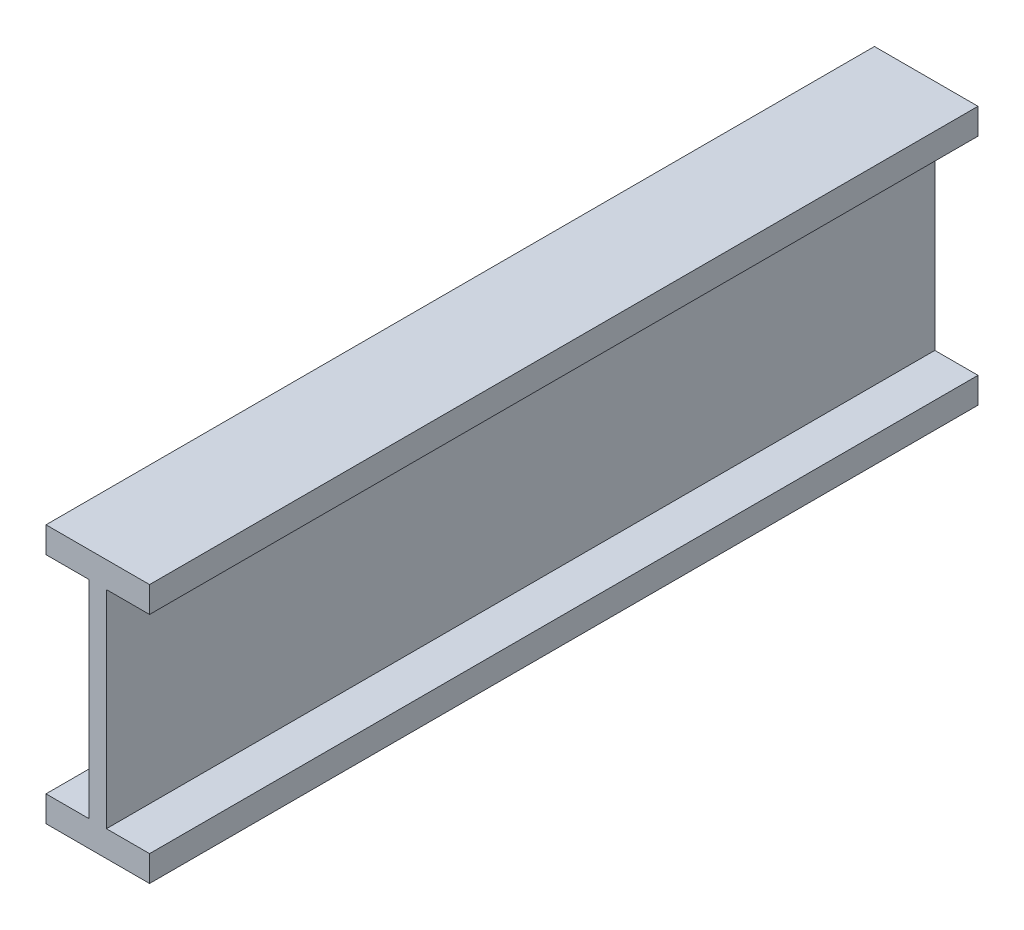
ISO-10303-21;
HEADER;
FILE_DESCRIPTION(('STEP AP214'),'2;1');
FILE_NAME('part.step','',(''),(''),'','','');
FILE_SCHEMA(('AUTOMOTIVE_DESIGN { 1 0 10303 214 1 1 1 1 }'));
ENDSEC;
DATA;
#1=APPLICATION_CONTEXT('core data for automotive mechanical design processes');
#2=APPLICATION_PROTOCOL_DEFINITION('international standard','automotive_design',2000,#1);
#3=PRODUCT_CONTEXT('',#1,'mechanical');
#4=PRODUCT('Part','Part','',(#3));
#5=PRODUCT_RELATED_PRODUCT_CATEGORY('part','',(#4));
#6=PRODUCT_DEFINITION_FORMATION('','',#4);
#7=PRODUCT_DEFINITION_CONTEXT('part definition',#1,'design');
#8=PRODUCT_DEFINITION('design','',#6,#7);
#9=PRODUCT_DEFINITION_SHAPE('','',#8);
#10=(LENGTH_UNIT() NAMED_UNIT(*) SI_UNIT(.MILLI.,.METRE.));
#11=(NAMED_UNIT(*) PLANE_ANGLE_UNIT() SI_UNIT($,.RADIAN.));
#12=(NAMED_UNIT(*) SI_UNIT($,.STERADIAN.) SOLID_ANGLE_UNIT());
#13=UNCERTAINTY_MEASURE_WITH_UNIT(LENGTH_MEASURE(1.E-05),#10,'distance_accuracy_value','');
#14=(GEOMETRIC_REPRESENTATION_CONTEXT(3) GLOBAL_UNCERTAINTY_ASSIGNED_CONTEXT((#13)) GLOBAL_UNIT_ASSIGNED_CONTEXT((#10,
#11,#12)) REPRESENTATION_CONTEXT('',''));
#15=CARTESIAN_POINT('',(0.,0.,0.));
#16=DIRECTION('',(0.,0.,1.));
#17=DIRECTION('',(1.,0.,0.));
#18=AXIS2_PLACEMENT_3D('',#15,#16,#17);
#19=CARTESIAN_POINT('',(76.2000000000001,0.,1219.2));
#20=DIRECTION('',(1.,0.,0.));
#21=DIRECTION('',(0.,1.,0.));
#22=AXIS2_PLACEMENT_3D('',#19,#20,#21);
#23=PLANE('',#22);
#24=DIRECTION('',(0.,-1.,0.));
#25=VECTOR('',#24,1.);
#26=CARTESIAN_POINT('',(76.2000000000001,0.,0.));
#27=LINE('',#26,#25);
#28=CARTESIAN_POINT('',(76.2,190.5,0.));
#29=VERTEX_POINT('',#28);
#30=CARTESIAN_POINT('',(76.2,152.4,0.));
#31=VERTEX_POINT('',#30);
#32=EDGE_CURVE('E196',#29,#31,#27,.T.);
#33=ORIENTED_EDGE('',*,*,#32,.F.);
#34=DIRECTION('',(0.,0.,-1.));
#35=VECTOR('',#34,1.);
#36=CARTESIAN_POINT('',(76.2,190.5,1219.2));
#37=LINE('',#36,#35);
#38=CARTESIAN_POINT('',(76.2,190.5,1219.2));
#39=VERTEX_POINT('',#38);
#40=EDGE_CURVE('E11',#39,#29,#37,.T.);
#41=ORIENTED_EDGE('',*,*,#40,.F.);
#42=DIRECTION('',(0.,-1.,0.));
#43=VECTOR('',#42,1.);
#44=CARTESIAN_POINT('',(76.2000000000001,0.,1219.2));
#45=LINE('',#44,#43);
#46=CARTESIAN_POINT('',(76.2,152.4,1219.2));
#47=VERTEX_POINT('',#46);
#48=EDGE_CURVE('E172',#39,#47,#45,.T.);
#49=ORIENTED_EDGE('',*,*,#48,.T.);
#50=DIRECTION('',(0.,0.,-1.));
#51=VECTOR('',#50,1.);
#52=CARTESIAN_POINT('',(76.2,152.4,1219.2));
#53=LINE('',#52,#51);
#54=EDGE_CURVE('E100',#47,#31,#53,.T.);
#55=ORIENTED_EDGE('',*,*,#54,.T.);
#56=EDGE_LOOP('',(#33,#41,#49,#55));
#57=FACE_BOUND('',#56,.T.);
#58=ADVANCED_FACE('F38',(#57),#23,.T.);
#59=CARTESIAN_POINT('',(0.,190.5,1219.2));
#60=DIRECTION('',(0.,1.,0.));
#61=DIRECTION('',(0.,0.,1.));
#62=AXIS2_PLACEMENT_3D('',#59,#60,#61);
#63=PLANE('',#62);
#64=DIRECTION('',(1.,0.,0.));
#65=VECTOR('',#64,1.);
#66=CARTESIAN_POINT('',(0.,190.5,0.));
#67=LINE('',#66,#65);
#68=CARTESIAN_POINT('',(-76.2,190.5,0.));
#69=VERTEX_POINT('',#68);
#70=EDGE_CURVE('E191',#69,#29,#67,.T.);
#71=ORIENTED_EDGE('',*,*,#70,.F.);
#72=DIRECTION('',(0.,0.,-1.));
#73=VECTOR('',#72,1.);
#74=CARTESIAN_POINT('',(-76.2,190.5,1219.2));
#75=LINE('',#74,#73);
#76=CARTESIAN_POINT('',(-76.2,190.5,1219.2));
#77=VERTEX_POINT('',#76);
#78=EDGE_CURVE('E46',#77,#69,#75,.T.);
#79=ORIENTED_EDGE('',*,*,#78,.F.);
#80=DIRECTION('',(1.,0.,0.));
#81=VECTOR('',#80,1.);
#82=CARTESIAN_POINT('',(0.,190.5,1219.2));
#83=LINE('',#82,#81);
#84=EDGE_CURVE('E169',#77,#39,#83,.T.);
#85=ORIENTED_EDGE('',*,*,#84,.T.);
#86=ORIENTED_EDGE('',*,*,#40,.T.);
#87=EDGE_LOOP('',(#71,#79,#85,#86));
#88=FACE_BOUND('',#87,.T.);
#89=ADVANCED_FACE('F234',(#88),#63,.T.);
#90=CARTESIAN_POINT('',(-76.2000000000001,0.,1219.2));
#91=DIRECTION('',(1.,0.,0.));
#92=DIRECTION('',(0.,1.,0.));
#93=AXIS2_PLACEMENT_3D('',#90,#91,#92);
#94=PLANE('',#93);
#95=DIRECTION('',(0.,-1.,0.));
#96=VECTOR('',#95,1.);
#97=CARTESIAN_POINT('',(-76.2000000000001,0.,0.));
#98=LINE('',#97,#96);
#99=CARTESIAN_POINT('',(-76.2,152.4,0.));
#100=VERTEX_POINT('',#99);
#101=EDGE_CURVE('E184',#69,#100,#98,.T.);
#102=ORIENTED_EDGE('',*,*,#101,.T.);
#103=DIRECTION('',(0.,0.,-1.));
#104=VECTOR('',#103,1.);
#105=CARTESIAN_POINT('',(-76.2,152.4,1219.2));
#106=LINE('',#105,#104);
#107=CARTESIAN_POINT('',(-76.2,152.4,1219.2));
#108=VERTEX_POINT('',#107);
#109=EDGE_CURVE('E226',#108,#100,#106,.T.);
#110=ORIENTED_EDGE('',*,*,#109,.F.);
#111=DIRECTION('',(0.,-1.,0.));
#112=VECTOR('',#111,1.);
#113=CARTESIAN_POINT('',(-76.2000000000001,0.,1219.2));
#114=LINE('',#113,#112);
#115=EDGE_CURVE('E165',#77,#108,#114,.T.);
#116=ORIENTED_EDGE('',*,*,#115,.F.);
#117=ORIENTED_EDGE('',*,*,#78,.T.);
#118=EDGE_LOOP('',(#102,#110,#116,#117));
#119=FACE_BOUND('',#118,.T.);
#120=ADVANCED_FACE('F228',(#119),#94,.F.);
#121=CARTESIAN_POINT('',(0.,152.4,1219.2));
#122=DIRECTION('',(0.,1.,0.));
#123=DIRECTION('',(0.,0.,1.));
#124=AXIS2_PLACEMENT_3D('',#121,#122,#123);
#125=PLANE('',#124);
#126=DIRECTION('',(1.,0.,0.));
#127=VECTOR('',#126,1.);
#128=CARTESIAN_POINT('',(0.,152.4,0.));
#129=LINE('',#128,#127);
#130=CARTESIAN_POINT('',(-12.7,152.4,0.));
#131=VERTEX_POINT('',#130);
#132=EDGE_CURVE('E175',#100,#131,#129,.T.);
#133=ORIENTED_EDGE('',*,*,#132,.T.);
#134=DIRECTION('',(0.,0.,-1.));
#135=VECTOR('',#134,1.);
#136=CARTESIAN_POINT('',(-12.7,152.4,1219.2));
#137=LINE('',#136,#135);
#138=CARTESIAN_POINT('',(-12.7,152.4,1219.2));
#139=VERTEX_POINT('',#138);
#140=EDGE_CURVE('E224',#139,#131,#137,.T.);
#141=ORIENTED_EDGE('',*,*,#140,.F.);
#142=DIRECTION('',(1.,0.,0.));
#143=VECTOR('',#142,1.);
#144=CARTESIAN_POINT('',(0.,152.4,1219.2));
#145=LINE('',#144,#143);
#146=EDGE_CURVE('E162',#108,#139,#145,.T.);
#147=ORIENTED_EDGE('',*,*,#146,.F.);
#148=ORIENTED_EDGE('',*,*,#109,.T.);
#149=EDGE_LOOP('',(#133,#141,#147,#148));
#150=FACE_BOUND('',#149,.T.);
#151=ADVANCED_FACE('F248',(#150),#125,.F.);
#152=CARTESIAN_POINT('',(-12.7,0.,1219.2));
#153=DIRECTION('',(-1.,0.,0.));
#154=DIRECTION('',(0.,0.,1.));
#155=AXIS2_PLACEMENT_3D('',#152,#153,#154);
#156=PLANE('',#155);
#157=DIRECTION('',(0.,1.,0.));
#158=VECTOR('',#157,1.);
#159=CARTESIAN_POINT('',(-12.7,0.,0.));
#160=LINE('',#159,#158);
#161=CARTESIAN_POINT('',(-12.7,-152.4,0.));
#162=VERTEX_POINT('',#161);
#163=EDGE_CURVE('E183',#162,#131,#160,.T.);
#164=ORIENTED_EDGE('',*,*,#163,.F.);
#165=DIRECTION('',(0.,0.,-1.));
#166=VECTOR('',#165,1.);
#167=CARTESIAN_POINT('',(-12.7,-152.4,1219.2));
#168=LINE('',#167,#166);
#169=CARTESIAN_POINT('',(-12.7,-152.4,1219.2));
#170=VERTEX_POINT('',#169);
#171=EDGE_CURVE('E222',#170,#162,#168,.T.);
#172=ORIENTED_EDGE('',*,*,#171,.F.);
#173=DIRECTION('',(0.,1.,0.));
#174=VECTOR('',#173,1.);
#175=CARTESIAN_POINT('',(-12.7,0.,1219.2));
#176=LINE('',#175,#174);
#177=EDGE_CURVE('E157',#170,#139,#176,.T.);
#178=ORIENTED_EDGE('',*,*,#177,.T.);
#179=ORIENTED_EDGE('',*,*,#140,.T.);
#180=EDGE_LOOP('',(#164,#172,#178,#179));
#181=FACE_BOUND('',#180,.T.);
#182=ADVANCED_FACE('F257',(#181),#156,.T.);
#183=CARTESIAN_POINT('',(0.,-152.4,1219.2));
#184=DIRECTION('',(0.,1.,0.));
#185=DIRECTION('',(0.,0.,1.));
#186=AXIS2_PLACEMENT_3D('',#183,#184,#185);
#187=PLANE('',#186);
#188=DIRECTION('',(1.,0.,0.));
#189=VECTOR('',#188,1.);
#190=CARTESIAN_POINT('',(0.,-152.4,0.));
#191=LINE('',#190,#189);
#192=CARTESIAN_POINT('',(-76.2,-152.4,0.));
#193=VERTEX_POINT('',#192);
#194=EDGE_CURVE('E190',#193,#162,#191,.T.);
#195=ORIENTED_EDGE('',*,*,#194,.F.);
#196=DIRECTION('',(0.,0.,-1.));
#197=VECTOR('',#196,1.);
#198=CARTESIAN_POINT('',(-76.2,-152.4,1219.2));
#199=LINE('',#198,#197);
#200=CARTESIAN_POINT('',(-76.2,-152.4,1219.2));
#201=VERTEX_POINT('',#200);
#202=EDGE_CURVE('E220',#201,#193,#199,.T.);
#203=ORIENTED_EDGE('',*,*,#202,.F.);
#204=DIRECTION('',(1.,0.,0.));
#205=VECTOR('',#204,1.);
#206=CARTESIAN_POINT('',(0.,-152.4,1219.2));
#207=LINE('',#206,#205);
#208=EDGE_CURVE('E150',#201,#170,#207,.T.);
#209=ORIENTED_EDGE('',*,*,#208,.T.);
#210=ORIENTED_EDGE('',*,*,#171,.T.);
#211=EDGE_LOOP('',(#195,#203,#209,#210));
#212=FACE_BOUND('',#211,.T.);
#213=ADVANCED_FACE('F269',(#212),#187,.T.);
#214=CARTESIAN_POINT('',(-76.2,0.,1219.2));
#215=DIRECTION('',(-1.,0.,0.));
#216=DIRECTION('',(0.,0.,1.));
#217=AXIS2_PLACEMENT_3D('',#214,#215,#216);
#218=PLANE('',#217);
#219=DIRECTION('',(0.,1.,0.));
#220=VECTOR('',#219,1.);
#221=CARTESIAN_POINT('',(-76.2,0.,0.));
#222=LINE('',#221,#220);
#223=CARTESIAN_POINT('',(-76.2,-190.5,0.));
#224=VERTEX_POINT('',#223);
#225=EDGE_CURVE('E239',#224,#193,#222,.T.);
#226=ORIENTED_EDGE('',*,*,#225,.F.);
#227=DIRECTION('',(0.,0.,-1.));
#228=VECTOR('',#227,1.);
#229=CARTESIAN_POINT('',(-76.2,-190.5,1219.2));
#230=LINE('',#229,#228);
#231=CARTESIAN_POINT('',(-76.2,-190.5,1219.2));
#232=VERTEX_POINT('',#231);
#233=EDGE_CURVE('E212',#232,#224,#230,.T.);
#234=ORIENTED_EDGE('',*,*,#233,.F.);
#235=DIRECTION('',(0.,1.,0.));
#236=VECTOR('',#235,1.);
#237=CARTESIAN_POINT('',(-76.2,0.,1219.2));
#238=LINE('',#237,#236);
#239=EDGE_CURVE('E156',#232,#201,#238,.T.);
#240=ORIENTED_EDGE('',*,*,#239,.T.);
#241=ORIENTED_EDGE('',*,*,#202,.T.);
#242=EDGE_LOOP('',(#226,#234,#240,#241));
#243=FACE_BOUND('',#242,.T.);
#244=ADVANCED_FACE('F270',(#243),#218,.T.);
#245=CARTESIAN_POINT('',(0.,-190.5,1219.2));
#246=DIRECTION('',(0.,1.,0.));
#247=DIRECTION('',(0.,0.,1.));
#248=AXIS2_PLACEMENT_3D('',#245,#246,#247);
#249=PLANE('',#248);
#250=DIRECTION('',(1.,0.,0.));
#251=VECTOR('',#250,1.);
#252=CARTESIAN_POINT('',(0.,-190.5,0.));
#253=LINE('',#252,#251);
#254=CARTESIAN_POINT('',(76.2,-190.5,0.));
#255=VERTEX_POINT('',#254);
#256=EDGE_CURVE('E208',#224,#255,#253,.T.);
#257=ORIENTED_EDGE('',*,*,#256,.T.);
#258=DIRECTION('',(0.,0.,-1.));
#259=VECTOR('',#258,1.);
#260=CARTESIAN_POINT('',(76.2,-190.5,1219.2));
#261=LINE('',#260,#259);
#262=CARTESIAN_POINT('',(76.2,-190.5,1219.2));
#263=VERTEX_POINT('',#262);
#264=EDGE_CURVE('E205',#263,#255,#261,.T.);
#265=ORIENTED_EDGE('',*,*,#264,.F.);
#266=DIRECTION('',(1.,0.,0.));
#267=VECTOR('',#266,1.);
#268=CARTESIAN_POINT('',(0.,-190.5,1219.2));
#269=LINE('',#268,#267);
#270=EDGE_CURVE('E151',#232,#263,#269,.T.);
#271=ORIENTED_EDGE('',*,*,#270,.F.);
#272=ORIENTED_EDGE('',*,*,#233,.T.);
#273=EDGE_LOOP('',(#257,#265,#271,#272));
#274=FACE_BOUND('',#273,.T.);
#275=ADVANCED_FACE('F206',(#274),#249,.F.);
#276=CARTESIAN_POINT('',(76.2,0.,1219.2));
#277=DIRECTION('',(-1.,0.,0.));
#278=DIRECTION('',(0.,0.,1.));
#279=AXIS2_PLACEMENT_3D('',#276,#277,#278);
#280=PLANE('',#279);
#281=DIRECTION('',(0.,1.,0.));
#282=VECTOR('',#281,1.);
#283=CARTESIAN_POINT('',(76.2,0.,0.));
#284=LINE('',#283,#282);
#285=CARTESIAN_POINT('',(76.2,-152.4,0.));
#286=VERTEX_POINT('',#285);
#287=EDGE_CURVE('E215',#255,#286,#284,.T.);
#288=ORIENTED_EDGE('',*,*,#287,.T.);
#289=DIRECTION('',(0.,0.,-1.));
#290=VECTOR('',#289,1.);
#291=CARTESIAN_POINT('',(76.2,-152.4,1219.2));
#292=LINE('',#291,#290);
#293=CARTESIAN_POINT('',(76.2,-152.4,1219.2));
#294=VERTEX_POINT('',#293);
#295=EDGE_CURVE('E139',#294,#286,#292,.T.);
#296=ORIENTED_EDGE('',*,*,#295,.F.);
#297=DIRECTION('',(0.,1.,0.));
#298=VECTOR('',#297,1.);
#299=CARTESIAN_POINT('',(76.2,0.,1219.2));
#300=LINE('',#299,#298);
#301=EDGE_CURVE('E147',#263,#294,#300,.T.);
#302=ORIENTED_EDGE('',*,*,#301,.F.);
#303=ORIENTED_EDGE('',*,*,#264,.T.);
#304=EDGE_LOOP('',(#288,#296,#302,#303));
#305=FACE_BOUND('',#304,.T.);
#306=ADVANCED_FACE('F214',(#305),#280,.F.);
#307=CARTESIAN_POINT('',(12.7,-152.4,0.));
#308=VERTEX_POINT('',#307);
#309=EDGE_CURVE('E138',#308,#286,#191,.T.);
#310=ORIENTED_EDGE('',*,*,#309,.F.);
#311=DIRECTION('',(0.,0.,-1.));
#312=VECTOR('',#311,1.);
#313=CARTESIAN_POINT('',(12.7,-152.4,1219.2));
#314=LINE('',#313,#312);
#315=CARTESIAN_POINT('',(12.7,-152.4,1219.2));
#316=VERTEX_POINT('',#315);
#317=EDGE_CURVE('E132',#316,#308,#314,.T.);
#318=ORIENTED_EDGE('',*,*,#317,.F.);
#319=EDGE_CURVE('E136',#316,#294,#207,.T.);
#320=ORIENTED_EDGE('',*,*,#319,.T.);
#321=ORIENTED_EDGE('',*,*,#295,.T.);
#322=EDGE_LOOP('',(#310,#318,#320,#321));
#323=FACE_BOUND('',#322,.T.);
#324=ADVANCED_FACE('F134',(#323),#187,.T.);
#325=CARTESIAN_POINT('',(12.7,0.,1219.2));
#326=DIRECTION('',(-1.,0.,0.));
#327=DIRECTION('',(0.,0.,1.));
#328=AXIS2_PLACEMENT_3D('',#325,#326,#327);
#329=PLANE('',#328);
#330=DIRECTION('',(0.,1.,0.));
#331=VECTOR('',#330,1.);
#332=CARTESIAN_POINT('',(12.7,0.,0.));
#333=LINE('',#332,#331);
#334=CARTESIAN_POINT('',(12.7,152.4,0.));
#335=VERTEX_POINT('',#334);
#336=EDGE_CURVE('E93',#308,#335,#333,.T.);
#337=ORIENTED_EDGE('',*,*,#336,.T.);
#338=DIRECTION('',(0.,0.,-1.));
#339=VECTOR('',#338,1.);
#340=CARTESIAN_POINT('',(12.7,152.4,1219.2));
#341=LINE('',#340,#339);
#342=CARTESIAN_POINT('',(12.7,152.4,1219.2));
#343=VERTEX_POINT('',#342);
#344=EDGE_CURVE('E140',#343,#335,#341,.T.);
#345=ORIENTED_EDGE('',*,*,#344,.F.);
#346=DIRECTION('',(0.,1.,0.));
#347=VECTOR('',#346,1.);
#348=CARTESIAN_POINT('',(12.7,0.,1219.2));
#349=LINE('',#348,#347);
#350=EDGE_CURVE('E142',#316,#343,#349,.T.);
#351=ORIENTED_EDGE('',*,*,#350,.F.);
#352=ORIENTED_EDGE('',*,*,#317,.T.);
#353=EDGE_LOOP('',(#337,#345,#351,#352));
#354=FACE_BOUND('',#353,.T.);
#355=ADVANCED_FACE('F143',(#354),#329,.F.);
#356=EDGE_CURVE('E173',#335,#31,#129,.T.);
#357=ORIENTED_EDGE('',*,*,#356,.T.);
#358=ORIENTED_EDGE('',*,*,#54,.F.);
#359=EDGE_CURVE('E54',#343,#47,#145,.T.);
#360=ORIENTED_EDGE('',*,*,#359,.F.);
#361=ORIENTED_EDGE('',*,*,#344,.T.);
#362=EDGE_LOOP('',(#357,#358,#360,#361));
#363=FACE_BOUND('',#362,.T.);
#364=ADVANCED_FACE('F245',(#363),#125,.F.);
#365=CARTESIAN_POINT('',(0.,0.,1219.2));
#366=DIRECTION('',(0.,0.,1.));
#367=DIRECTION('',(1.,0.,0.));
#368=AXIS2_PLACEMENT_3D('',#365,#366,#367);
#369=PLANE('',#368);
#370=ORIENTED_EDGE('',*,*,#48,.F.);
#371=ORIENTED_EDGE('',*,*,#84,.F.);
#372=ORIENTED_EDGE('',*,*,#115,.T.);
#373=ORIENTED_EDGE('',*,*,#146,.T.);
#374=ORIENTED_EDGE('',*,*,#177,.F.);
#375=ORIENTED_EDGE('',*,*,#208,.F.);
#376=ORIENTED_EDGE('',*,*,#239,.F.);
#377=ORIENTED_EDGE('',*,*,#270,.T.);
#378=ORIENTED_EDGE('',*,*,#301,.T.);
#379=ORIENTED_EDGE('',*,*,#319,.F.);
#380=ORIENTED_EDGE('',*,*,#350,.T.);
#381=ORIENTED_EDGE('',*,*,#359,.T.);
#382=EDGE_LOOP('',(#370,#371,#372,#373,#374,#375,#376,#377,#378,#379,#380,#381));
#383=FACE_BOUND('',#382,.T.);
#384=ADVANCED_FACE('F145',(#383),#369,.T.);
#385=CARTESIAN_POINT('',(0.,0.,0.));
#386=DIRECTION('',(0.,0.,1.));
#387=DIRECTION('',(1.,0.,0.));
#388=AXIS2_PLACEMENT_3D('',#385,#386,#387);
#389=PLANE('',#388);
#390=ORIENTED_EDGE('',*,*,#32,.T.);
#391=ORIENTED_EDGE('',*,*,#356,.F.);
#392=ORIENTED_EDGE('',*,*,#336,.F.);
#393=ORIENTED_EDGE('',*,*,#309,.T.);
#394=ORIENTED_EDGE('',*,*,#287,.F.);
#395=ORIENTED_EDGE('',*,*,#256,.F.);
#396=ORIENTED_EDGE('',*,*,#225,.T.);
#397=ORIENTED_EDGE('',*,*,#194,.T.);
#398=ORIENTED_EDGE('',*,*,#163,.T.);
#399=ORIENTED_EDGE('',*,*,#132,.F.);
#400=ORIENTED_EDGE('',*,*,#101,.F.);
#401=ORIENTED_EDGE('',*,*,#70,.T.);
#402=EDGE_LOOP('',(#390,#391,#392,#393,#394,#395,#396,#397,#398,#399,#400,#401));
#403=FACE_BOUND('',#402,.T.);
#404=ADVANCED_FACE('F233',(#403),#389,.F.);
#405=CLOSED_SHELL('',(#58,#89,#120,#151,#182,#213,#244,#275,#306,#324,#355,#364,#384,#404));
#406=MANIFOLD_SOLID_BREP('B2',#405);
#407=ADVANCED_BREP_SHAPE_REPRESENTATION('',(#18,#406),#14);
#408=SHAPE_DEFINITION_REPRESENTATION(#9,#407);
ENDSEC;
END-ISO-10303-21;
